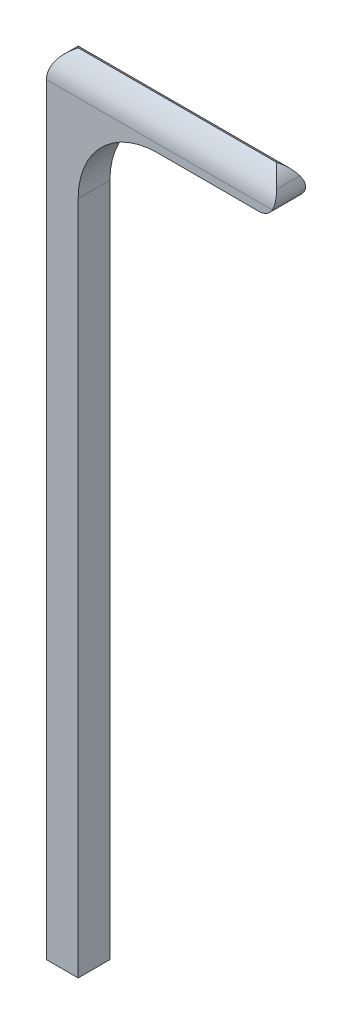
ISO-10303-21;
HEADER;
FILE_DESCRIPTION(('STEP AP214'),'2;1');
FILE_NAME('part.step','',(''),(''),'','','');
FILE_SCHEMA(('AUTOMOTIVE_DESIGN { 1 0 10303 214 1 1 1 1 }'));
ENDSEC;
DATA;
#1=APPLICATION_CONTEXT('core data for automotive mechanical design processes');
#2=APPLICATION_PROTOCOL_DEFINITION('international standard','automotive_design',2000,#1);
#3=PRODUCT_CONTEXT('',#1,'mechanical');
#4=PRODUCT('Part','Part','',(#3));
#5=PRODUCT_RELATED_PRODUCT_CATEGORY('part','',(#4));
#6=PRODUCT_DEFINITION_FORMATION('','',#4);
#7=PRODUCT_DEFINITION_CONTEXT('part definition',#1,'design');
#8=PRODUCT_DEFINITION('design','',#6,#7);
#9=PRODUCT_DEFINITION_SHAPE('','',#8);
#10=(LENGTH_UNIT() NAMED_UNIT(*) SI_UNIT(.MILLI.,.METRE.));
#11=(NAMED_UNIT(*) PLANE_ANGLE_UNIT() SI_UNIT($,.RADIAN.));
#12=(NAMED_UNIT(*) SI_UNIT($,.STERADIAN.) SOLID_ANGLE_UNIT());
#13=UNCERTAINTY_MEASURE_WITH_UNIT(LENGTH_MEASURE(1.E-05),#10,'distance_accuracy_value','');
#14=(GEOMETRIC_REPRESENTATION_CONTEXT(3) GLOBAL_UNCERTAINTY_ASSIGNED_CONTEXT((#13)) GLOBAL_UNIT_ASSIGNED_CONTEXT((#10,
#11,#12)) REPRESENTATION_CONTEXT('',''));
#15=CARTESIAN_POINT('',(0.,0.,0.));
#16=DIRECTION('',(0.,0.,1.));
#17=DIRECTION('',(1.,0.,0.));
#18=AXIS2_PLACEMENT_3D('',#15,#16,#17);
#19=CARTESIAN_POINT('',(4.,96.,0.));
#20=DIRECTION('',(0.,0.,1.));
#21=DIRECTION('',(1.,0.,0.));
#22=AXIS2_PLACEMENT_3D('',#19,#20,#21);
#23=CYLINDRICAL_SURFACE('',#22,4.);
#24=CARTESIAN_POINT('',(4.,96.,-4.));
#25=DIRECTION('',(0.707106781186547,0.,0.707106781186547));
#26=DIRECTION('',(-0.707106781186547,0.,0.707106781186547));
#27=AXIS2_PLACEMENT_3D('',#24,#25,#26);
#28=ELLIPSE('',#27,5.65685424949238,4.);
#29=CARTESIAN_POINT('',(0.,96.,0.));
#30=VERTEX_POINT('',#29);
#31=CARTESIAN_POINT('',(2.,99.4641016151378,-2.));
#32=VERTEX_POINT('',#31);
#33=EDGE_CURVE('E168',#30,#32,#28,.F.);
#34=ORIENTED_EDGE('',*,*,#33,.T.);
#35=CARTESIAN_POINT('',(4.,96.,0.));
#36=DIRECTION('',(-0.707106781186547,0.,0.707106781186547));
#37=DIRECTION('',(0.707106781186547,0.,0.707106781186547));
#38=AXIS2_PLACEMENT_3D('',#35,#36,#37);
#39=ELLIPSE('',#38,5.65685424949238,4.);
#40=CARTESIAN_POINT('',(0.,96.,-4.));
#41=VERTEX_POINT('',#40);
#42=EDGE_CURVE('E162',#41,#32,#39,.F.);
#43=ORIENTED_EDGE('',*,*,#42,.F.);
#44=DIRECTION('',(0.,0.,1.));
#45=VECTOR('',#44,1.);
#46=CARTESIAN_POINT('',(0.,96.,0.));
#47=LINE('',#46,#45);
#48=EDGE_CURVE('E159',#30,#41,#47,.F.);
#49=ORIENTED_EDGE('',*,*,#48,.F.);
#50=EDGE_LOOP('',(#34,#43,#49));
#51=FACE_BOUND('',#50,.T.);
#52=ADVANCED_FACE('F33',(#51),#23,.T.);
#53=CARTESIAN_POINT('',(0.,96.,-4.));
#54=DIRECTION('',(1.,0.,0.));
#55=DIRECTION('',(0.,0.,-1.));
#56=AXIS2_PLACEMENT_3D('',#53,#54,#55);
#57=CYLINDRICAL_SURFACE('',#56,4.);
#58=DIRECTION('',(1.,0.,0.));
#59=VECTOR('',#58,1.);
#60=CARTESIAN_POINT('',(0.,96.,0.));
#61=LINE('',#60,#59);
#62=CARTESIAN_POINT('',(28.4641016151378,96.,0.));
#63=VERTEX_POINT('',#62);
#64=EDGE_CURVE('E113',#63,#30,#61,.F.);
#65=ORIENTED_EDGE('',*,*,#64,.F.);
#66=CARTESIAN_POINT('',(28.4641016151378,96.,0.));
#67=CARTESIAN_POINT('',(28.4899205214123,96.0447052768712,5.81212095050014E-06));
#68=CARTESIAN_POINT('',(28.5139974046784,96.0904196488186,-0.000749347118922359));
#69=CARTESIAN_POINT('',(28.5585302876101,96.1835266890571,-0.0039424408975705));
#70=CARTESIAN_POINT('',(28.5789859803853,96.2309194991853,-0.00638051797532231));
#71=CARTESIAN_POINT('',(28.6160925282097,96.3269253658367,-0.0130926124151326));
#72=CARTESIAN_POINT('',(28.6327520209303,96.3755353671179,-0.0173623968277684));
#73=CARTESIAN_POINT('',(28.6622371901726,96.4736821919284,-0.0278384519322126));
#74=CARTESIAN_POINT('',(28.6750631633307,96.5232189434307,-0.0340445727149227));
#75=CARTESIAN_POINT('',(28.7077296046553,96.6727686271664,-0.0557023298577122));
#76=CARTESIAN_POINT('',(28.7217482583709,96.773694031684,-0.0741916035135775));
#77=CARTESIAN_POINT('',(28.7344273181474,96.9746206809775,-0.119183283020323));
#78=CARTESIAN_POINT('',(28.7330887246306,97.0746219855275,-0.145685166793543));
#79=CARTESIAN_POINT('',(28.7159632464746,97.2720357520867,-0.206230204677328));
#80=CARTESIAN_POINT('',(28.7000396605246,97.3694147307807,-0.240342395972516));
#81=CARTESIAN_POINT('',(28.6549219537185,97.5585984560853,-0.31474398565343));
#82=CARTESIAN_POINT('',(28.6257214291225,97.650400488571,-0.355036358646031));
#83=CARTESIAN_POINT('',(28.5725388933702,97.7842279601631,-0.419622619812209));
#84=CARTESIAN_POINT('',(28.5528630604707,97.8288544345154,-0.442229486530185));
#85=CARTESIAN_POINT('',(28.5106155239734,97.9159909720622,-0.488390561068443));
#86=CARTESIAN_POINT('',(28.4880533278501,97.9585073745424,-0.511941491731265));
#87=CARTESIAN_POINT('',(28.4641016151385,98.0000000000003,-0.535898384862337));
#88=B_SPLINE_CURVE_WITH_KNOTS('',3,(#66,#67,#68,#69,#70,#71,#72,#73,#74,#75,#76,#77,#78,#79,#80,
#81,#82,#83,#84,#85,#86,#87),.UNSPECIFIED.,.F.,.F.,(4,2,2,2,2,2,2,2,2,2,4),(0.,
0.154834954942789,0.30968302563253,0.464175164613099,0.618655345943507,0.92770135039563,
1.23672722267436,1.54867948511903,1.86078236840751,2.02194206292195,2.18258395554593),.UNSPECIFIED.);
#89=CARTESIAN_POINT('',(28.4641016151378,98.,-0.535898384862247));
#90=VERTEX_POINT('',#89);
#91=EDGE_CURVE('E11',#63,#90,#88,.T.);
#92=ORIENTED_EDGE('',*,*,#91,.T.);
#93=CARTESIAN_POINT('',(25.,96.,-4.));
#94=DIRECTION('',(0.707106781186547,0.,-0.707106781186547));
#95=DIRECTION('',(0.707106781186547,0.,0.707106781186547));
#96=AXIS2_PLACEMENT_3D('',#93,#94,#95);
#97=ELLIPSE('',#96,5.65685424949238,4.);
#98=CARTESIAN_POINT('',(27.,99.4641016151378,-2.));
#99=VERTEX_POINT('',#98);
#100=EDGE_CURVE('E171',#99,#90,#97,.T.);
#101=ORIENTED_EDGE('',*,*,#100,.F.);
#102=DIRECTION('',(1.,0.,0.));
#103=VECTOR('',#102,1.);
#104=CARTESIAN_POINT('',(0.,99.4641016151378,-2.));
#105=LINE('',#104,#103);
#106=EDGE_CURVE('E161',#32,#99,#105,.T.);
#107=ORIENTED_EDGE('',*,*,#106,.F.);
#108=ORIENTED_EDGE('',*,*,#33,.F.);
#109=EDGE_LOOP('',(#65,#92,#101,#107,#108));
#110=FACE_BOUND('',#109,.T.);
#111=ADVANCED_FACE('F199',(#110),#57,.T.);
#112=CARTESIAN_POINT('',(25.,96.,0.));
#113=DIRECTION('',(0.,0.,1.));
#114=DIRECTION('',(1.,0.,0.));
#115=AXIS2_PLACEMENT_3D('',#112,#113,#114);
#116=CYLINDRICAL_SURFACE('',#115,4.);
#117=ORIENTED_EDGE('',*,*,#100,.T.);
#118=DIRECTION('',(0.,0.,1.));
#119=VECTOR('',#118,1.);
#120=CARTESIAN_POINT('',(28.4641016151378,98.,0.));
#121=LINE('',#120,#119);
#122=CARTESIAN_POINT('',(28.4641016151378,98.,-3.46410161513775));
#123=VERTEX_POINT('',#122);
#124=EDGE_CURVE('E175',#90,#123,#121,.F.);
#125=ORIENTED_EDGE('',*,*,#124,.T.);
#126=CARTESIAN_POINT('',(25.,96.,0.));
#127=DIRECTION('',(0.707106781186547,0.,0.707106781186547));
#128=DIRECTION('',(-0.707106781186547,0.,0.707106781186547));
#129=AXIS2_PLACEMENT_3D('',#126,#127,#128);
#130=ELLIPSE('',#129,5.65685424949238,4.);
#131=EDGE_CURVE('E165',#99,#123,#130,.F.);
#132=ORIENTED_EDGE('',*,*,#131,.F.);
#133=EDGE_LOOP('',(#117,#125,#132));
#134=FACE_BOUND('',#133,.T.);
#135=ADVANCED_FACE('F193',(#134),#116,.T.);
#136=CARTESIAN_POINT('',(0.,96.,0.));
#137=DIRECTION('',(-1.,0.,0.));
#138=DIRECTION('',(0.,0.,1.));
#139=AXIS2_PLACEMENT_3D('',#136,#137,#138);
#140=CYLINDRICAL_SURFACE('',#139,4.);
#141=ORIENTED_EDGE('',*,*,#131,.T.);
#142=CARTESIAN_POINT('',(28.4641016151378,98.,-3.46410161513775));
#143=CARTESIAN_POINT('',(28.4909046872014,97.9535629100378,-3.49091299418451));
#144=CARTESIAN_POINT('',(28.5159690147904,97.9058475161277,-3.5172139316994));
#145=CARTESIAN_POINT('',(28.5624020974313,97.8079366071143,-3.56853285281765));
#146=CARTESIAN_POINT('',(28.583767897183,97.7577391495201,-3.59354979932545));
#147=CARTESIAN_POINT('',(28.6421066474586,97.6031839578837,-3.66643882706158));
#148=CARTESIAN_POINT('',(28.6730716358879,97.4952895160315,-3.71189898369489));
#149=CARTESIAN_POINT('',(28.7167375981063,97.272056548516,-3.79421826040077));
#150=CARTESIAN_POINT('',(28.729348469134,97.1566841836168,-3.83103420936745));
#151=CARTESIAN_POINT('',(28.7339624785909,96.9228456678115,-3.89396131940593));
#152=CARTESIAN_POINT('',(28.7260188229221,96.8043882887324,-3.9200999161601));
#153=CARTESIAN_POINT('',(28.6907754673571,96.5821049977076,-3.95884686712497));
#154=CARTESIAN_POINT('',(28.6657327025105,96.4781203569943,-3.97263887401097));
#155=CARTESIAN_POINT('',(28.5990392220274,96.2749212119881,-3.99184030107304));
#156=CARTESIAN_POINT('',(28.5574151125029,96.1756993498464,-3.99726308273115));
#157=CARTESIAN_POINT('',(28.4940910626028,96.0533386639454,-3.99973962660653));
#158=CARTESIAN_POINT('',(28.4793997907193,96.0264839038103,-4.00000458840415));
#159=CARTESIAN_POINT('',(28.4641016151377,96.,-4.));
#160=B_SPLINE_CURVE_WITH_KNOTS('',3,(#142,#143,#144,#145,#146,#147,#148,#149,#150,#151,#152,
#153,#154,#155,#156,#157,#158,#159),.UNSPECIFIED.,.F.,.F.,(4,2,2,2,2,2,2,2,4),(0.,
0.179760703092268,0.359664387095747,0.721113529766409,1.08433115726333,1.44660952802915,
1.7684942273169,2.0898645035994,2.18165672802535),.UNSPECIFIED.);
#161=CARTESIAN_POINT('',(28.4641016151378,96.,-4.));
#162=VERTEX_POINT('',#161);
#163=EDGE_CURVE('E178',#123,#162,#160,.T.);
#164=ORIENTED_EDGE('',*,*,#163,.T.);
#165=DIRECTION('',(-1.,0.,0.));
#166=VECTOR('',#165,1.);
#167=CARTESIAN_POINT('',(0.,96.,-4.));
#168=LINE('',#167,#166);
#169=EDGE_CURVE('E155',#41,#162,#168,.F.);
#170=ORIENTED_EDGE('',*,*,#169,.F.);
#171=ORIENTED_EDGE('',*,*,#42,.T.);
#172=ORIENTED_EDGE('',*,*,#106,.T.);
#173=EDGE_LOOP('',(#141,#164,#170,#171,#172));
#174=FACE_BOUND('',#173,.T.);
#175=ADVANCED_FACE('F187',(#174),#140,.T.);
#176=CARTESIAN_POINT('',(4.,100.,0.));
#177=DIRECTION('',(-1.,0.,0.));
#178=DIRECTION('',(0.,0.,1.));
#179=AXIS2_PLACEMENT_3D('',#176,#177,#178);
#180=PLANE('',#179);
#181=DIRECTION('',(0.,-1.,0.));
#182=VECTOR('',#181,1.);
#183=CARTESIAN_POINT('',(4.,100.,-4.));
#184=LINE('',#183,#182);
#185=CARTESIAN_POINT('',(4.,85.,-4.));
#186=VERTEX_POINT('',#185);
#187=CARTESIAN_POINT('',(4.,0.,-4.));
#188=VERTEX_POINT('',#187);
#189=EDGE_CURVE('E143',#186,#188,#184,.T.);
#190=ORIENTED_EDGE('',*,*,#189,.F.);
#191=DIRECTION('',(0.,0.,-1.));
#192=VECTOR('',#191,1.);
#193=CARTESIAN_POINT('',(4.,85.,0.));
#194=LINE('',#193,#192);
#195=CARTESIAN_POINT('',(4.,85.,0.));
#196=VERTEX_POINT('',#195);
#197=EDGE_CURVE('E148',#186,#196,#194,.F.);
#198=ORIENTED_EDGE('',*,*,#197,.T.);
#199=DIRECTION('',(0.,-1.,0.));
#200=VECTOR('',#199,1.);
#201=CARTESIAN_POINT('',(4.,100.,0.));
#202=LINE('',#201,#200);
#203=CARTESIAN_POINT('',(4.,0.,0.));
#204=VERTEX_POINT('',#203);
#205=EDGE_CURVE('E119',#196,#204,#202,.T.);
#206=ORIENTED_EDGE('',*,*,#205,.T.);
#207=DIRECTION('',(0.,0.,-1.));
#208=VECTOR('',#207,1.);
#209=CARTESIAN_POINT('',(4.,0.,0.));
#210=LINE('',#209,#208);
#211=EDGE_CURVE('E127',#204,#188,#210,.T.);
#212=ORIENTED_EDGE('',*,*,#211,.T.);
#213=EDGE_LOOP('',(#190,#198,#206,#212));
#214=FACE_BOUND('',#213,.T.);
#215=ADVANCED_FACE('F192',(#214),#180,.F.);
#216=CARTESIAN_POINT('',(0.,100.,0.));
#217=DIRECTION('',(1.,0.,0.));
#218=DIRECTION('',(0.,0.,-1.));
#219=AXIS2_PLACEMENT_3D('',#216,#217,#218);
#220=PLANE('',#219);
#221=DIRECTION('',(0.,-1.,0.));
#222=VECTOR('',#221,1.);
#223=CARTESIAN_POINT('',(0.,100.,0.));
#224=LINE('',#223,#222);
#225=CARTESIAN_POINT('',(0.,0.,0.));
#226=VERTEX_POINT('',#225);
#227=EDGE_CURVE('E107',#30,#226,#224,.T.);
#228=ORIENTED_EDGE('',*,*,#227,.F.);
#229=ORIENTED_EDGE('',*,*,#48,.T.);
#230=DIRECTION('',(0.,-1.,0.));
#231=VECTOR('',#230,1.);
#232=CARTESIAN_POINT('',(0.,100.,-4.));
#233=LINE('',#232,#231);
#234=CARTESIAN_POINT('',(0.,0.,-4.));
#235=VERTEX_POINT('',#234);
#236=EDGE_CURVE('E131',#41,#235,#233,.T.);
#237=ORIENTED_EDGE('',*,*,#236,.T.);
#238=DIRECTION('',(0.,0.,1.));
#239=VECTOR('',#238,1.);
#240=CARTESIAN_POINT('',(0.,0.,0.));
#241=LINE('',#240,#239);
#242=EDGE_CURVE('E125',#235,#226,#241,.T.);
#243=ORIENTED_EDGE('',*,*,#242,.T.);
#244=EDGE_LOOP('',(#228,#229,#237,#243));
#245=FACE_BOUND('',#244,.T.);
#246=ADVANCED_FACE('F129',(#245),#220,.F.);
#247=CARTESIAN_POINT('',(0.,100.,0.));
#248=DIRECTION('',(0.,0.,-1.));
#249=DIRECTION('',(-1.,0.,0.));
#250=AXIS2_PLACEMENT_3D('',#247,#248,#249);
#251=PLANE('',#250);
#252=DIRECTION('',(-1.,0.,0.));
#253=VECTOR('',#252,1.);
#254=CARTESIAN_POINT('',(29.,95.,0.));
#255=LINE('',#254,#253);
#256=CARTESIAN_POINT('',(26.7320508075689,95.,0.));
#257=VERTEX_POINT('',#256);
#258=CARTESIAN_POINT('',(14.,95.,0.));
#259=VERTEX_POINT('',#258);
#260=EDGE_CURVE('E133',#257,#259,#255,.T.);
#261=ORIENTED_EDGE('',*,*,#260,.F.);
#262=CARTESIAN_POINT('',(26.7320508075689,97.,0.));
#263=DIRECTION('',(0.,0.,-1.));
#264=DIRECTION('',(-1.,0.,0.));
#265=AXIS2_PLACEMENT_3D('',#262,#263,#264);
#266=CIRCLE('',#265,2.);
#267=EDGE_CURVE('E46',#257,#63,#266,.F.);
#268=ORIENTED_EDGE('',*,*,#267,.T.);
#269=ORIENTED_EDGE('',*,*,#64,.T.);
#270=ORIENTED_EDGE('',*,*,#227,.T.);
#271=DIRECTION('',(1.,0.,0.));
#272=VECTOR('',#271,1.);
#273=CARTESIAN_POINT('',(0.,0.,0.));
#274=LINE('',#273,#272);
#275=EDGE_CURVE('E111',#226,#204,#274,.T.);
#276=ORIENTED_EDGE('',*,*,#275,.T.);
#277=ORIENTED_EDGE('',*,*,#205,.F.);
#278=CARTESIAN_POINT('',(14.,85.,0.));
#279=DIRECTION('',(0.,0.,-1.));
#280=DIRECTION('',(-1.,0.,0.));
#281=AXIS2_PLACEMENT_3D('',#278,#279,#280);
#282=CIRCLE('',#281,10.);
#283=EDGE_CURVE('E152',#196,#259,#282,.T.);
#284=ORIENTED_EDGE('',*,*,#283,.T.);
#285=EDGE_LOOP('',(#261,#268,#269,#270,#276,#277,#284));
#286=FACE_BOUND('',#285,.T.);
#287=ADVANCED_FACE('F109',(#286),#251,.F.);
#288=CARTESIAN_POINT('',(0.,100.,-4.));
#289=DIRECTION('',(0.,0.,1.));
#290=DIRECTION('',(1.,0.,0.));
#291=AXIS2_PLACEMENT_3D('',#288,#289,#290);
#292=PLANE('',#291);
#293=ORIENTED_EDGE('',*,*,#169,.T.);
#294=CARTESIAN_POINT('',(26.7320508075689,97.,-4.));
#295=DIRECTION('',(0.,0.,1.));
#296=DIRECTION('',(1.,0.,0.));
#297=AXIS2_PLACEMENT_3D('',#294,#295,#296);
#298=CIRCLE('',#297,2.);
#299=CARTESIAN_POINT('',(26.7320508075689,95.,-4.));
#300=VERTEX_POINT('',#299);
#301=EDGE_CURVE('E185',#162,#300,#298,.F.);
#302=ORIENTED_EDGE('',*,*,#301,.T.);
#303=DIRECTION('',(-1.,0.,0.));
#304=VECTOR('',#303,1.);
#305=CARTESIAN_POINT('',(29.,95.,-4.));
#306=LINE('',#305,#304);
#307=CARTESIAN_POINT('',(14.,95.,-4.));
#308=VERTEX_POINT('',#307);
#309=EDGE_CURVE('E135',#300,#308,#306,.T.);
#310=ORIENTED_EDGE('',*,*,#309,.T.);
#311=CARTESIAN_POINT('',(14.,85.,-4.));
#312=DIRECTION('',(0.,0.,1.));
#313=DIRECTION('',(1.,0.,0.));
#314=AXIS2_PLACEMENT_3D('',#311,#312,#313);
#315=CIRCLE('',#314,10.);
#316=EDGE_CURVE('E150',#308,#186,#315,.T.);
#317=ORIENTED_EDGE('',*,*,#316,.T.);
#318=ORIENTED_EDGE('',*,*,#189,.T.);
#319=DIRECTION('',(-1.,0.,0.));
#320=VECTOR('',#319,1.);
#321=CARTESIAN_POINT('',(0.,0.,-4.));
#322=LINE('',#321,#320);
#323=EDGE_CURVE('E140',#188,#235,#322,.T.);
#324=ORIENTED_EDGE('',*,*,#323,.T.);
#325=ORIENTED_EDGE('',*,*,#236,.F.);
#326=EDGE_LOOP('',(#293,#302,#310,#317,#318,#324,#325));
#327=FACE_BOUND('',#326,.T.);
#328=ADVANCED_FACE('F217',(#327),#292,.F.);
#329=CARTESIAN_POINT('',(0.,0.,0.));
#330=DIRECTION('',(0.,-1.,0.));
#331=DIRECTION('',(0.,0.,-1.));
#332=AXIS2_PLACEMENT_3D('',#329,#330,#331);
#333=PLANE('',#332);
#334=ORIENTED_EDGE('',*,*,#242,.F.);
#335=ORIENTED_EDGE('',*,*,#323,.F.);
#336=ORIENTED_EDGE('',*,*,#211,.F.);
#337=ORIENTED_EDGE('',*,*,#275,.F.);
#338=EDGE_LOOP('',(#334,#335,#336,#337));
#339=FACE_BOUND('',#338,.T.);
#340=ADVANCED_FACE('F123',(#339),#333,.T.);
#341=CARTESIAN_POINT('',(29.,95.,-4.));
#342=DIRECTION('',(0.,1.,0.));
#343=DIRECTION('',(0.,0.,1.));
#344=AXIS2_PLACEMENT_3D('',#341,#342,#343);
#345=PLANE('',#344);
#346=ORIENTED_EDGE('',*,*,#309,.F.);
#347=DIRECTION('',(0.,0.,-1.));
#348=VECTOR('',#347,1.);
#349=CARTESIAN_POINT('',(26.7320508075689,95.,0.));
#350=LINE('',#349,#348);
#351=EDGE_CURVE('E60',#300,#257,#350,.F.);
#352=ORIENTED_EDGE('',*,*,#351,.T.);
#353=ORIENTED_EDGE('',*,*,#260,.T.);
#354=DIRECTION('',(0.,0.,-1.));
#355=VECTOR('',#354,1.);
#356=CARTESIAN_POINT('',(14.,95.,-4.));
#357=LINE('',#356,#355);
#358=EDGE_CURVE('E118',#259,#308,#357,.T.);
#359=ORIENTED_EDGE('',*,*,#358,.T.);
#360=EDGE_LOOP('',(#346,#352,#353,#359));
#361=FACE_BOUND('',#360,.T.);
#362=ADVANCED_FACE('F225',(#361),#345,.F.);
#363=CARTESIAN_POINT('',(14.,85.,-4.));
#364=DIRECTION('',(0.,0.,1.));
#365=DIRECTION('',(1.,0.,0.));
#366=AXIS2_PLACEMENT_3D('',#363,#364,#365);
#367=CYLINDRICAL_SURFACE('',#366,10.);
#368=ORIENTED_EDGE('',*,*,#283,.F.);
#369=ORIENTED_EDGE('',*,*,#197,.F.);
#370=ORIENTED_EDGE('',*,*,#316,.F.);
#371=ORIENTED_EDGE('',*,*,#358,.F.);
#372=EDGE_LOOP('',(#368,#369,#370,#371));
#373=FACE_BOUND('',#372,.T.);
#374=ADVANCED_FACE('F195',(#373),#367,.F.);
#375=CARTESIAN_POINT('',(26.7320508075689,97.,0.));
#376=DIRECTION('',(0.,0.,1.));
#377=DIRECTION('',(1.,0.,0.));
#378=AXIS2_PLACEMENT_3D('',#375,#376,#377);
#379=CYLINDRICAL_SURFACE('',#378,2.);
#380=ORIENTED_EDGE('',*,*,#267,.F.);
#381=ORIENTED_EDGE('',*,*,#351,.F.);
#382=ORIENTED_EDGE('',*,*,#301,.F.);
#383=ORIENTED_EDGE('',*,*,#163,.F.);
#384=ORIENTED_EDGE('',*,*,#124,.F.);
#385=ORIENTED_EDGE('',*,*,#91,.F.);
#386=EDGE_LOOP('',(#380,#381,#382,#383,#384,#385));
#387=FACE_BOUND('',#386,.T.);
#388=ADVANCED_FACE('F35',(#387),#379,.T.);
#389=CLOSED_SHELL('',(#52,#111,#135,#175,#215,#246,#287,#328,#340,#362,#374,#388));
#390=MANIFOLD_SOLID_BREP('B2',#389);
#391=ADVANCED_BREP_SHAPE_REPRESENTATION('',(#18,#390),#14);
#392=SHAPE_DEFINITION_REPRESENTATION(#9,#391);
ENDSEC;
END-ISO-10303-21;
